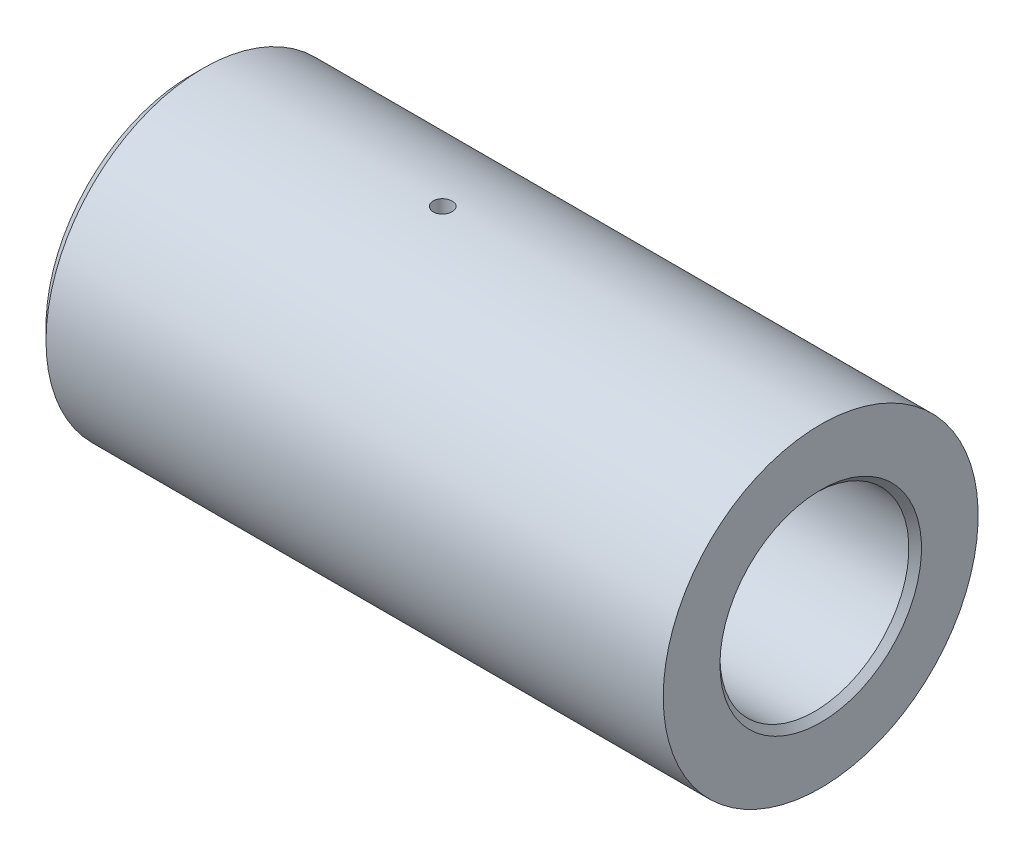
ISO-10303-21;
HEADER;
FILE_DESCRIPTION(('STEP AP214'),'2;1');
FILE_NAME('part.step','',(''),(''),'','','');
FILE_SCHEMA(('AUTOMOTIVE_DESIGN { 1 0 10303 214 1 1 1 1 }'));
ENDSEC;
DATA;
#1=APPLICATION_CONTEXT('core data for automotive mechanical design processes');
#2=APPLICATION_PROTOCOL_DEFINITION('international standard','automotive_design',2000,#1);
#3=PRODUCT_CONTEXT('',#1,'mechanical');
#4=PRODUCT('Part','Part','',(#3));
#5=PRODUCT_RELATED_PRODUCT_CATEGORY('part','',(#4));
#6=PRODUCT_DEFINITION_FORMATION('','',#4);
#7=PRODUCT_DEFINITION_CONTEXT('part definition',#1,'design');
#8=PRODUCT_DEFINITION('design','',#6,#7);
#9=PRODUCT_DEFINITION_SHAPE('','',#8);
#10=(LENGTH_UNIT() NAMED_UNIT(*) SI_UNIT(.MILLI.,.METRE.));
#11=(NAMED_UNIT(*) PLANE_ANGLE_UNIT() SI_UNIT($,.RADIAN.));
#12=(NAMED_UNIT(*) SI_UNIT($,.STERADIAN.) SOLID_ANGLE_UNIT());
#13=UNCERTAINTY_MEASURE_WITH_UNIT(LENGTH_MEASURE(1.E-05),#10,'distance_accuracy_value','');
#14=(GEOMETRIC_REPRESENTATION_CONTEXT(3) GLOBAL_UNCERTAINTY_ASSIGNED_CONTEXT((#13)) GLOBAL_UNIT_ASSIGNED_CONTEXT((#10,
#11,#12)) REPRESENTATION_CONTEXT('',''));
#15=CARTESIAN_POINT('',(0.,0.,0.));
#16=DIRECTION('',(0.,0.,1.));
#17=DIRECTION('',(1.,0.,0.));
#18=AXIS2_PLACEMENT_3D('',#15,#16,#17);
#19=CARTESIAN_POINT('',(0.,0.,0.));
#20=DIRECTION('',(-1.,0.,0.));
#21=DIRECTION('',(0.,0.,1.));
#22=AXIS2_PLACEMENT_3D('',#19,#20,#21);
#23=CYLINDRICAL_SURFACE('',#22,10.);
#24=CARTESIAN_POINT('',(0.999999999999977,0.,0.));
#25=DIRECTION('',(1.,0.,0.));
#26=DIRECTION('',(0.,0.,-1.));
#27=AXIS2_PLACEMENT_3D('',#24,#25,#26);
#28=CIRCLE('',#27,10.);
#29=CARTESIAN_POINT('',(0.999999999999977,0.,-10.));
#30=VERTEX_POINT('',#29);
#31=EDGE_CURVE('E58',#30,#30,#28,.F.);
#32=ORIENTED_EDGE('',*,*,#31,.T.);
#33=EDGE_LOOP('',(#32));
#34=FACE_BOUND('',#33,.T.);
#35=CARTESIAN_POINT('',(25.,0.,0.));
#36=DIRECTION('',(-1.,0.,0.));
#37=DIRECTION('',(0.,0.,1.));
#38=AXIS2_PLACEMENT_3D('',#35,#36,#37);
#39=CIRCLE('',#38,10.);
#40=CARTESIAN_POINT('',(25.,0.,10.));
#41=VERTEX_POINT('',#40);
#42=EDGE_CURVE('E188',#41,#41,#39,.T.);
#43=ORIENTED_EDGE('',*,*,#42,.F.);
#44=EDGE_LOOP('',(#43));
#45=FACE_BOUND('',#44,.T.);
#46=ADVANCED_FACE('F37',(#34,#45),#23,.F.);
#47=CARTESIAN_POINT('',(0.,10.,0.));
#48=DIRECTION('',(1.,0.,0.));
#49=DIRECTION('',(0.,0.,-1.));
#50=AXIS2_PLACEMENT_3D('',#47,#48,#49);
#51=PLANE('',#50);
#52=CARTESIAN_POINT('',(0.,0.,0.));
#53=DIRECTION('',(1.,0.,0.));
#54=DIRECTION('',(0.,0.,-1.));
#55=AXIS2_PLACEMENT_3D('',#52,#53,#54);
#56=CIRCLE('',#55,11.);
#57=CARTESIAN_POINT('',(0.,0.,-11.));
#58=VERTEX_POINT('',#57);
#59=EDGE_CURVE('E54',#58,#58,#56,.T.);
#60=ORIENTED_EDGE('',*,*,#59,.T.);
#61=EDGE_LOOP('',(#60));
#62=FACE_BOUND('',#61,.T.);
#63=CARTESIAN_POINT('',(0.,0.,0.));
#64=DIRECTION('',(1.,0.,0.));
#65=DIRECTION('',(0.,0.,-1.));
#66=AXIS2_PLACEMENT_3D('',#63,#64,#65);
#67=CIRCLE('',#66,23.);
#68=CARTESIAN_POINT('',(0.,0.,-23.));
#69=VERTEX_POINT('',#68);
#70=EDGE_CURVE('E161',#69,#69,#67,.F.);
#71=ORIENTED_EDGE('',*,*,#70,.T.);
#72=EDGE_LOOP('',(#71));
#73=FACE_BOUND('',#72,.T.);
#74=ADVANCED_FACE('F118',(#62,#73),#51,.F.);
#75=CARTESIAN_POINT('',(0.,0.,0.));
#76=DIRECTION('',(-1.,0.,0.));
#77=DIRECTION('',(0.,0.,1.));
#78=AXIS2_PLACEMENT_3D('',#75,#76,#77);
#79=CYLINDRICAL_SURFACE('',#78,25.);
#80=CARTESIAN_POINT('',(38.5,-25.,0.));
#81=CARTESIAN_POINT('',(38.500003706182,-24.9999994009396,0.0841744112906983));
#82=CARTESIAN_POINT('',(38.5071091377062,-24.9995703322505,0.168407925575419));
#83=CARTESIAN_POINT('',(38.5353523915698,-24.9978999420123,0.334549549235281));
#84=CARTESIAN_POINT('',(38.5565065901217,-24.9966576725644,0.416454828330709));
#85=CARTESIAN_POINT('',(38.6122380148838,-24.9935014300757,0.5755093310273));
#86=CARTESIAN_POINT('',(38.6468082125669,-24.9915878088006,0.652661020509562));
#87=CARTESIAN_POINT('',(38.7283790480555,-24.9873041548427,0.800046136146097));
#88=CARTESIAN_POINT('',(38.7753768200272,-24.9849342274195,0.870281152186768));
#89=CARTESIAN_POINT('',(38.8805405728725,-24.9800007098428,1.00195727834145));
#90=CARTESIAN_POINT('',(38.9387201682725,-24.9774368859408,1.0633875072824));
#91=CARTESIAN_POINT('',(39.064568149316,-24.9724065327507,1.17561728443768));
#92=CARTESIAN_POINT('',(39.132236929305,-24.9699400075116,1.22641639063194));
#93=CARTESIAN_POINT('',(39.2752032782622,-24.9653806252969,1.31597486784903));
#94=CARTESIAN_POINT('',(39.3505064633041,-24.9632880465787,1.35472528905778));
#95=CARTESIAN_POINT('',(39.5065646395759,-24.9597155336563,1.41902912258916));
#96=CARTESIAN_POINT('',(39.5873195759334,-24.9582355932868,1.44458266771711));
#97=CARTESIAN_POINT('',(39.7518848579348,-24.9560574575134,1.48173741565118));
#98=CARTESIAN_POINT('',(39.8356913703657,-24.9553583140724,1.49335553999937));
#99=CARTESIAN_POINT('',(40.0040677798979,-24.954817773996,1.50236188160072));
#100=CARTESIAN_POINT('',(40.0886376689152,-24.954976368288,1.49975024936641));
#101=CARTESIAN_POINT('',(40.2560249625796,-24.9561325386846,1.48038526467145));
#102=CARTESIAN_POINT('',(40.3388444934696,-24.9571290288072,1.46365021721638));
#103=CARTESIAN_POINT('',(40.5004967591683,-24.9598469788447,1.41654183568935));
#104=CARTESIAN_POINT('',(40.5793294716157,-24.9615684428253,1.38616842513185));
#105=CARTESIAN_POINT('',(40.7308291732036,-24.9655435872457,1.31262469930024));
#106=CARTESIAN_POINT('',(40.8034921175736,-24.9677976132153,1.26944607125188));
#107=CARTESIAN_POINT('',(40.94054542463,-24.9725835122349,1.17152362364147));
#108=CARTESIAN_POINT('',(41.004935701836,-24.9751153881552,1.11677968459202));
#109=CARTESIAN_POINT('',(41.1237223810788,-24.9801764756538,0.997177453913965));
#110=CARTESIAN_POINT('',(41.1781028321263,-24.9827056767018,0.932303318346458));
#111=CARTESIAN_POINT('',(41.275203187104,-24.9874725341813,0.794337807078347));
#112=CARTESIAN_POINT('',(41.3179230872505,-24.9897101905182,0.721246428711381));
#113=CARTESIAN_POINT('',(41.3904882900073,-24.9936419598513,0.568911628096267));
#114=CARTESIAN_POINT('',(41.4203329988203,-24.9953360477775,0.489667922304728));
#115=CARTESIAN_POINT('',(41.4662900315718,-24.9979894319355,0.327282186584158));
#116=CARTESIAN_POINT('',(41.4824025033425,-24.9989487360774,0.244140198631621));
#117=CARTESIAN_POINT('',(41.5004179459624,-25.0000234317371,0.0764564081212715));
#118=CARTESIAN_POINT('',(41.5023429725754,-25.000140133157,-0.00808301680837487));
#119=CARTESIAN_POINT('',(41.4919864934571,-24.9995199551995,-0.176283598525665));
#120=CARTESIAN_POINT('',(41.4797050557785,-24.998783079911,-0.25994475951849));
#121=CARTESIAN_POINT('',(41.4413025336056,-24.9965395546253,-0.423951918612617));
#122=CARTESIAN_POINT('',(41.4151915577337,-24.9950334669082,-0.504300292000608));
#123=CARTESIAN_POINT('',(41.3498814166804,-24.991420983828,-0.659474362375056));
#124=CARTESIAN_POINT('',(41.3106821429513,-24.9893145834861,-0.73430001355259));
#125=CARTESIAN_POINT('',(41.2202519136995,-24.9847349543981,-0.876405673907379));
#126=CARTESIAN_POINT('',(41.1690062158468,-24.982261277559,-0.943676287014668));
#127=CARTESIAN_POINT('',(41.0559592915908,-24.9772270256052,-1.06866774190152));
#128=CARTESIAN_POINT('',(40.9941579691759,-24.9746664497003,-1.12638849680831));
#129=CARTESIAN_POINT('',(40.8616590117008,-24.9697432142549,-1.23071636822772));
#130=CARTESIAN_POINT('',(40.7909501058566,-24.9673808118859,-1.27730918435508));
#131=CARTESIAN_POINT('',(40.6426998598921,-24.9631244152043,-1.35796077823128));
#132=CARTESIAN_POINT('',(40.5651585592251,-24.9612304181871,-1.39201962835089));
#133=CARTESIAN_POINT('',(40.4054970323861,-24.9581262710517,-1.44661168369627));
#134=CARTESIAN_POINT('',(40.3233799015864,-24.9569156646707,-1.46715391475466));
#135=CARTESIAN_POINT('',(40.1568546515416,-24.9553135506001,-1.49415910044393));
#136=CARTESIAN_POINT('',(40.0724465529164,-24.9549220355407,-1.50062218175197));
#137=CARTESIAN_POINT('',(39.9038776251556,-24.9550024337275,-1.49928439559963));
#138=CARTESIAN_POINT('',(39.8197166160021,-24.955472985906,-1.49150601316709));
#139=CARTESIAN_POINT('',(39.6538978753677,-24.9572216088909,-1.46195268745905));
#140=CARTESIAN_POINT('',(39.5722401484791,-24.9584996811785,-1.44017771850782));
#141=CARTESIAN_POINT('',(39.413742287979,-24.9617189844004,-1.38325430313315));
#142=CARTESIAN_POINT('',(39.3369021374244,-24.9636602130022,-1.34810590374646));
#143=CARTESIAN_POINT('',(39.1902110162464,-24.9679870227359,-1.26543658450865));
#144=CARTESIAN_POINT('',(39.1203598574009,-24.9703725918963,-1.2179159979801));
#145=CARTESIAN_POINT('',(38.9895157860027,-24.9753236195898,-1.11176851558593));
#146=CARTESIAN_POINT('',(38.9285359962889,-24.9778893364568,-1.05312545630152));
#147=CARTESIAN_POINT('',(38.8172659186456,-24.9829093861692,-0.926417671082014));
#148=CARTESIAN_POINT('',(38.7669782528211,-24.9853636915766,-0.858350640782171));
#149=CARTESIAN_POINT('',(38.678485842974,-24.9898867196811,-0.714654868135344));
#150=CARTESIAN_POINT('',(38.6402953770515,-24.9919549855695,-0.639017327934042));
#151=CARTESIAN_POINT('',(38.5772024182904,-24.9954666177913,-0.482446674586143));
#152=CARTESIAN_POINT('',(38.5522843340497,-24.9969107169712,-0.401519900921799));
#153=CARTESIAN_POINT('',(38.5229328707374,-24.9986320978355,-0.266746945425286));
#154=CARTESIAN_POINT('',(38.5143441337415,-24.9991427869583,-0.213772324734724));
#155=CARTESIAN_POINT('',(38.5028765216484,-24.9998269286143,-0.107206461740472));
#156=CARTESIAN_POINT('',(38.4999976393329,-25.0000003815739,-0.0536152202163858));
#157=CARTESIAN_POINT('',(38.5,-25.,0.));
#158=B_SPLINE_CURVE_WITH_KNOTS('',3,(#80,#81,#82,#83,#84,#85,#86,#87,#88,#89,#90,#91,#92,#93,
#94,#95,#96,#97,#98,#99,#100,#101,#102,#103,#104,#105,#106,#107,#108,#109,#110,#111,#112,#113,
#114,#115,#116,#117,#118,#119,#120,#121,#122,#123,#124,#125,#126,#127,#128,#129,#130,#131,#132,
#133,#134,#135,#136,#137,#138,#139,#140,#141,#142,#143,#144,#145,#146,#147,#148,#149,#150,#151,
#152,#153,#154,#155,#156,#157),.UNSPECIFIED.,.T.,.F.,(4,2,2,2,2,2,2,2,2,2,2,2,2,2,2,2,2,2,2,2,2,
2,2,2,2,2,2,2,2,2,2,2,2,2,2,2,2,2,4),(0.,0.252327509077057,0.504949665992943,0.757439654594841,
1.00987146898755,1.26261260362566,1.51536424463009,1.76830318456219,2.02123957902124,
2.27386852521718,2.52649479928367,2.77879415269301,3.03109492104442,3.2835598355736,
3.53602735857987,3.78889377835759,4.04176028018659,4.29463844284422,4.54751388314835,
4.79999612089069,5.05247714918091,5.30477388207094,5.55707270743324,5.80968191670635,
6.06229342377877,6.31522783298443,6.56816078173089,6.82092466056897,7.07368626515452,
7.3260491430634,7.57841248391492,7.83077493716769,8.08313059215596,8.33585582543012,
8.58864296499107,8.84172736228347,9.09451379555064,9.25523499170701,9.41595598468309),.UNSPECIFIED.);
#159=CARTESIAN_POINT('',(38.5,-25.,0.));
#160=VERTEX_POINT('',#159);
#161=EDGE_CURVE('E10',#160,#160,#158,.T.);
#162=ORIENTED_EDGE('',*,*,#161,.T.);
#163=EDGE_LOOP('',(#162));
#164=FACE_BOUND('',#163,.T.);
#165=CARTESIAN_POINT('',(40.,24.9549594269356,1.49999999999999));
#166=CARTESIAN_POINT('',(39.915825742496,24.9549600300317,1.49999629367853));
#167=CARTESIAN_POINT('',(39.8315923814798,24.9553898919632,1.49289088723916));
#168=CARTESIAN_POINT('',(39.6654510762883,24.9570631163396,1.46464774207901));
#169=CARTESIAN_POINT('',(39.5835459625127,24.9583074281733,1.44349362662338));
#170=CARTESIAN_POINT('',(39.4244918092883,24.9614681027882,1.38776244497561));
#171=CARTESIAN_POINT('',(39.347340302558,24.9633841134208,1.35319241127322));
#172=CARTESIAN_POINT('',(39.1999554927473,24.9676718488877,1.2716219618701));
#173=CARTESIAN_POINT('',(39.1297206000115,24.9700434686372,1.22462441159698));
#174=CARTESIAN_POINT('',(38.9980443330509,24.9749789472156,1.1194608820427));
#175=CARTESIAN_POINT('',(38.93661387943,24.9775430388755,1.06128123877002));
#176=CARTESIAN_POINT('',(38.8243836690896,24.9825723731579,0.935433067856952));
#177=CARTESIAN_POINT('',(38.7735843537017,24.9850376116732,0.867764146481716));
#178=CARTESIAN_POINT('',(38.6840256589564,24.9895934208353,0.724797675208393));
#179=CARTESIAN_POINT('',(38.6452751906506,24.9916837136997,0.649494533535976));
#180=CARTESIAN_POINT('',(38.5809712580593,24.9952516671057,0.493436451566957));
#181=CARTESIAN_POINT('',(38.5554176615375,24.9967293337859,0.412681565907558));
#182=CARTESIAN_POINT('',(38.5182628043925,24.9989039357683,0.248116432778315));
#183=CARTESIAN_POINT('',(38.5066446183536,24.999601818096,0.164310019372329));
#184=CARTESIAN_POINT('',(38.4976381190678,25.0001414004183,-0.00406619674097467));
#185=CARTESIAN_POINT('',(38.5002496559621,24.9999831094297,-0.0886359913994625));
#186=CARTESIAN_POINT('',(38.5196144910425,24.9988289734266,-0.256023709101287));
#187=CARTESIAN_POINT('',(38.536349580158,24.9978342068609,-0.338843747190685));
#188=CARTESIAN_POINT('',(38.583458221337,24.9951203677711,-0.50049700582433));
#189=CARTESIAN_POINT('',(38.6138318489557,24.9934012912345,-0.57933020427949));
#190=CARTESIAN_POINT('',(38.6873760214698,24.9894305509762,-0.730830489828705));
#191=CARTESIAN_POINT('',(38.7305548280396,24.987178543607,-0.803493557011326));
#192=CARTESIAN_POINT('',(38.8284776551981,24.9823954231729,-0.940547033718832));
#193=CARTESIAN_POINT('',(38.8832217953822,24.9798643072219,-1.00493735768536));
#194=CARTESIAN_POINT('',(39.0028241670928,24.9748031593022,-1.12372380476942));
#195=CARTESIAN_POINT('',(39.0676982019148,24.972273135328,-1.17810401764929));
#196=CARTESIAN_POINT('',(39.2056634273535,24.9675033967139,-1.27520394033666));
#197=CARTESIAN_POINT('',(39.2787546209749,24.96526368218,-1.31792364588029));
#198=CARTESIAN_POINT('',(39.4310893750399,24.9613274543607,-1.39048870924374));
#199=CARTESIAN_POINT('',(39.5103332480124,24.9596309686913,-1.42033341256491));
#200=CARTESIAN_POINT('',(39.6727193465946,24.9569735139226,-1.46629038294868));
#201=CARTESIAN_POINT('',(39.7558615299454,24.9560125368521,-1.48240279883675));
#202=CARTESIAN_POINT('',(39.9235454057691,24.9549359603509,-1.50041803122796));
#203=CARTESIAN_POINT('',(40.0080847148941,24.9548190455977,-1.50234295653499));
#204=CARTESIAN_POINT('',(40.1762850405415,24.9554403428122,-1.4919863161538));
#205=CARTESIAN_POINT('',(40.2599460612687,24.9561785506842,-1.47970481851038));
#206=CARTESIAN_POINT('',(40.4239525508928,24.9584256981138,-1.44130231806504));
#207=CARTESIAN_POINT('',(40.5043004092051,24.9599340713456,-1.41519148386754));
#208=CARTESIAN_POINT('',(40.6594735122597,24.9635510809282,-1.34988179901678));
#209=CARTESIAN_POINT('',(40.734298710843,24.9656597222954,-1.31068283898678));
#210=CARTESIAN_POINT('',(40.8764040714476,24.9702428271324,-1.22025306655629));
#211=CARTESIAN_POINT('',(40.9436747865983,24.9727177398586,-1.16900743202448));
#212=CARTESIAN_POINT('',(41.0686664769422,24.9777529022322,-1.05596057652177));
#213=CARTESIAN_POINT('',(41.1263873656994,24.9803131526518,-0.994159260021291));
#214=CARTESIAN_POINT('',(41.2307155140826,24.9852343171827,-0.861660242357582));
#215=CARTESIAN_POINT('',(41.2773084725469,24.9875949722934,-0.790951269706825));
#216=CARTESIAN_POINT('',(41.3579603164173,24.9918472173968,-0.642700853338524));
#217=CARTESIAN_POINT('',(41.3920192742066,24.9937388100983,-0.56515944908116));
#218=CARTESIAN_POINT('',(41.4466114035117,24.9968385433506,-0.405497997606175));
#219=CARTESIAN_POINT('',(41.4671536474445,24.9980471422498,-0.323381061721332));
#220=CARTESIAN_POINT('',(41.4941589249725,24.9996465260776,-0.156856221762157));
#221=CARTESIAN_POINT('',(41.5006220842115,25.0000373183046,-0.072448338139416));
#222=CARTESIAN_POINT('',(41.4992845201593,24.9999570780358,0.0961207332461746));
#223=CARTESIAN_POINT('',(41.4915061889346,24.9994873984695,0.180282100246806));
#224=CARTESIAN_POINT('',(41.4619528395094,24.9977417270832,0.346101569050349));
#225=CARTESIAN_POINT('',(41.4401777962734,24.9964657338211,0.427759666375486));
#226=CARTESIAN_POINT('',(41.3832540983733,24.9932508853364,0.586258250769405));
#227=CARTESIAN_POINT('',(41.3481054900667,24.9913120324117,0.663098754536593));
#228=CARTESIAN_POINT('',(41.2654356440707,24.9869892318681,0.809790494584371));
#229=CARTESIAN_POINT('',(41.2179147400875,24.9846052962545,0.879641919304413));
#230=CARTESIAN_POINT('',(41.1117669143717,24.9796560975471,1.01048596126015));
#231=CARTESIAN_POINT('',(41.0531239014044,24.9770905751506,1.07146551413196));
#232=CARTESIAN_POINT('',(40.9264163054458,24.9720693720982,1.1827351356214));
#233=CARTESIAN_POINT('',(40.8583494175739,24.969613718509,1.23302258152253));
#234=CARTESIAN_POINT('',(40.7146537550239,24.9650870313927,1.32151476133075));
#235=CARTESIAN_POINT('',(40.6390161570939,24.9630164548729,1.35970517585709));
#236=CARTESIAN_POINT('',(40.4824453801455,24.9595002684231,1.42279802241095));
#237=CARTESIAN_POINT('',(40.4015185409405,24.9580539255344,1.44771604662733));
#238=CARTESIAN_POINT('',(40.266745746732,24.9563297281718,1.477067336489));
#239=CARTESIAN_POINT('',(40.2137713651314,24.9558181549229,1.48565599553077));
#240=CARTESIAN_POINT('',(40.1072059814227,24.9551328124479,1.49712350402983));
#241=CARTESIAN_POINT('',(40.0536149800991,24.9549590427922,1.50000236074967));
#242=CARTESIAN_POINT('',(40.,24.9549594269356,1.49999999999999));
#243=B_SPLINE_CURVE_WITH_KNOTS('',3,(#165,#166,#167,#168,#169,#170,#171,#172,#173,#174,#175,
#176,#177,#178,#179,#180,#181,#182,#183,#184,#185,#186,#187,#188,#189,#190,#191,#192,#193,#194,
#195,#196,#197,#198,#199,#200,#201,#202,#203,#204,#205,#206,#207,#208,#209,#210,#211,#212,#213,
#214,#215,#216,#217,#218,#219,#220,#221,#222,#223,#224,#225,#226,#227,#228,#229,#230,#231,#232,
#233,#234,#235,#236,#237,#238,#239,#240,#241,#242),.UNSPECIFIED.,.T.,.F.,(4,2,2,2,2,2,2,2,2,2,2,
2,2,2,2,2,2,2,2,2,2,2,2,2,2,2,2,2,2,2,2,2,2,2,2,2,2,2,4),(0.,0.252327047205413,
0.504948752345383,0.757438214199368,1.00986950993718,1.2626112488118,1.51536347770389,
1.76830219416344,2.02123837605551,2.27386703926159,2.52649304194185,2.77879383820878,
3.03109603219529,3.28356136253977,3.53602930372081,3.78889512066042,4.04176103006471,
4.29463979235215,4.54751581399801,4.7999976876621,5.05247835201358,5.30477362648824,
5.55707100943358,5.80968045699246,6.06229219080373,6.31522684471346,6.56816003791438,
6.82092328873067,7.07368428383796,7.32604820102925,7.57841256961529,7.83077606342528,
8.08313275117972,8.33585736760374,8.58864390468434,8.84172855917082,9.09451523445978,
9.25523571151601,9.41595598414488),.UNSPECIFIED.);
#244=CARTESIAN_POINT('',(40.,24.9549594269356,1.49999999999999));
#245=VERTEX_POINT('',#244);
#246=EDGE_CURVE('E50',#245,#245,#243,.T.);
#247=ORIENTED_EDGE('',*,*,#246,.T.);
#248=EDGE_LOOP('',(#247));
#249=FACE_BOUND('',#248,.T.);
#250=CARTESIAN_POINT('',(2.00000000000003,0.,0.));
#251=DIRECTION('',(1.,0.,0.));
#252=DIRECTION('',(0.,0.,-1.));
#253=AXIS2_PLACEMENT_3D('',#250,#251,#252);
#254=CIRCLE('',#253,25.);
#255=CARTESIAN_POINT('',(2.00000000000003,0.,-25.));
#256=VERTEX_POINT('',#255);
#257=EDGE_CURVE('E157',#256,#256,#254,.T.);
#258=ORIENTED_EDGE('',*,*,#257,.T.);
#259=EDGE_LOOP('',(#258));
#260=FACE_BOUND('',#259,.T.);
#261=CARTESIAN_POINT('',(100.,0.,0.));
#262=DIRECTION('',(-1.,0.,0.));
#263=DIRECTION('',(0.,0.,1.));
#264=AXIS2_PLACEMENT_3D('',#261,#262,#263);
#265=CIRCLE('',#264,25.);
#266=CARTESIAN_POINT('',(100.,0.,25.));
#267=VERTEX_POINT('',#266);
#268=EDGE_CURVE('E174',#267,#267,#265,.T.);
#269=ORIENTED_EDGE('',*,*,#268,.T.);
#270=EDGE_LOOP('',(#269));
#271=FACE_BOUND('',#270,.T.);
#272=ADVANCED_FACE('F64',(#164,#249,#260,#271),#79,.T.);
#273=CARTESIAN_POINT('',(100.,25.,0.));
#274=DIRECTION('',(-1.,0.,0.));
#275=DIRECTION('',(0.,0.,1.));
#276=AXIS2_PLACEMENT_3D('',#273,#274,#275);
#277=PLANE('',#276);
#278=CARTESIAN_POINT('',(100.,0.,0.));
#279=DIRECTION('',(-1.,0.,0.));
#280=DIRECTION('',(0.,0.,1.));
#281=AXIS2_PLACEMENT_3D('',#278,#279,#280);
#282=CIRCLE('',#281,16.);
#283=CARTESIAN_POINT('',(100.,0.,16.));
#284=VERTEX_POINT('',#283);
#285=EDGE_CURVE('E156',#284,#284,#282,.T.);
#286=ORIENTED_EDGE('',*,*,#285,.T.);
#287=EDGE_LOOP('',(#286));
#288=FACE_BOUND('',#287,.T.);
#289=ORIENTED_EDGE('',*,*,#268,.F.);
#290=EDGE_LOOP('',(#289));
#291=FACE_BOUND('',#290,.T.);
#292=ADVANCED_FACE('F111',(#288,#291),#277,.F.);
#293=CARTESIAN_POINT('',(0.,0.,0.));
#294=DIRECTION('',(-1.,0.,0.));
#295=DIRECTION('',(0.,0.,1.));
#296=AXIS2_PLACEMENT_3D('',#293,#294,#295);
#297=CYLINDRICAL_SURFACE('',#296,15.);
#298=CARTESIAN_POINT('',(99.,0.,0.));
#299=DIRECTION('',(-1.,0.,0.));
#300=DIRECTION('',(0.,0.,1.));
#301=AXIS2_PLACEMENT_3D('',#298,#299,#300);
#302=CIRCLE('',#301,15.);
#303=CARTESIAN_POINT('',(99.,0.,15.));
#304=VERTEX_POINT('',#303);
#305=EDGE_CURVE('E154',#304,#304,#302,.F.);
#306=ORIENTED_EDGE('',*,*,#305,.T.);
#307=EDGE_LOOP('',(#306));
#308=FACE_BOUND('',#307,.T.);
#309=CARTESIAN_POINT('',(65.,0.,0.));
#310=DIRECTION('',(-1.,0.,0.));
#311=DIRECTION('',(0.,0.,1.));
#312=AXIS2_PLACEMENT_3D('',#309,#310,#311);
#313=CIRCLE('',#312,15.);
#314=CARTESIAN_POINT('',(65.,0.,15.));
#315=VERTEX_POINT('',#314);
#316=EDGE_CURVE('E177',#315,#315,#313,.T.);
#317=ORIENTED_EDGE('',*,*,#316,.T.);
#318=EDGE_LOOP('',(#317));
#319=FACE_BOUND('',#318,.T.);
#320=ADVANCED_FACE('F108',(#308,#319),#297,.F.);
#321=CARTESIAN_POINT('',(65.,15.,0.));
#322=DIRECTION('',(1.,0.,0.));
#323=DIRECTION('',(0.,0.,-1.));
#324=AXIS2_PLACEMENT_3D('',#321,#322,#323);
#325=PLANE('',#324);
#326=ORIENTED_EDGE('',*,*,#316,.F.);
#327=EDGE_LOOP('',(#326));
#328=FACE_BOUND('',#327,.T.);
#329=CARTESIAN_POINT('',(65.,0.,0.));
#330=DIRECTION('',(-1.,0.,0.));
#331=DIRECTION('',(0.,0.,1.));
#332=AXIS2_PLACEMENT_3D('',#329,#330,#331);
#333=CIRCLE('',#332,18.);
#334=CARTESIAN_POINT('',(65.,0.,18.));
#335=VERTEX_POINT('',#334);
#336=EDGE_CURVE('E180',#335,#335,#333,.T.);
#337=ORIENTED_EDGE('',*,*,#336,.T.);
#338=EDGE_LOOP('',(#337));
#339=FACE_BOUND('',#338,.T.);
#340=ADVANCED_FACE('F104',(#328,#339),#325,.F.);
#341=CARTESIAN_POINT('',(0.,0.,0.));
#342=DIRECTION('',(-1.,0.,0.));
#343=DIRECTION('',(0.,0.,1.));
#344=AXIS2_PLACEMENT_3D('',#341,#342,#343);
#345=CYLINDRICAL_SURFACE('',#344,18.);
#346=ORIENTED_EDGE('',*,*,#336,.F.);
#347=EDGE_LOOP('',(#346));
#348=FACE_BOUND('',#347,.T.);
#349=CARTESIAN_POINT('',(60.,0.,0.));
#350=DIRECTION('',(-1.,0.,0.));
#351=DIRECTION('',(0.,0.,1.));
#352=AXIS2_PLACEMENT_3D('',#349,#350,#351);
#353=CIRCLE('',#352,18.);
#354=CARTESIAN_POINT('',(60.,0.,18.));
#355=VERTEX_POINT('',#354);
#356=EDGE_CURVE('E183',#355,#355,#353,.T.);
#357=ORIENTED_EDGE('',*,*,#356,.T.);
#358=EDGE_LOOP('',(#357));
#359=FACE_BOUND('',#358,.T.);
#360=ADVANCED_FACE('F100',(#348,#359),#345,.F.);
#361=CARTESIAN_POINT('',(60.,18.,0.));
#362=DIRECTION('',(-1.,0.,0.));
#363=DIRECTION('',(0.,0.,1.));
#364=AXIS2_PLACEMENT_3D('',#361,#362,#363);
#365=PLANE('',#364);
#366=ORIENTED_EDGE('',*,*,#356,.F.);
#367=EDGE_LOOP('',(#366));
#368=FACE_BOUND('',#367,.T.);
#369=CARTESIAN_POINT('',(60.,0.,0.));
#370=DIRECTION('',(-1.,0.,0.));
#371=DIRECTION('',(0.,0.,1.));
#372=AXIS2_PLACEMENT_3D('',#369,#370,#371);
#373=CIRCLE('',#372,15.);
#374=CARTESIAN_POINT('',(60.,0.,15.));
#375=VERTEX_POINT('',#374);
#376=EDGE_CURVE('E186',#375,#375,#373,.T.);
#377=ORIENTED_EDGE('',*,*,#376,.T.);
#378=EDGE_LOOP('',(#377));
#379=FACE_BOUND('',#378,.T.);
#380=ADVANCED_FACE('F95',(#368,#379),#365,.F.);
#381=CARTESIAN_POINT('',(0.,0.,0.));
#382=DIRECTION('',(-1.,0.,0.));
#383=DIRECTION('',(0.,0.,1.));
#384=AXIS2_PLACEMENT_3D('',#381,#382,#383);
#385=CYLINDRICAL_SURFACE('',#384,15.);
#386=CARTESIAN_POINT('',(40.,-14.9248115565993,1.49999999999999));
#387=CARTESIAN_POINT('',(39.9159706537396,-14.9248125419535,1.49999636009026));
#388=CARTESIAN_POINT('',(39.8318857473822,-14.9255288549133,1.4929152884737));
#389=CARTESIAN_POINT('',(39.6660472205597,-14.9283163133718,1.46477447214533));
#390=CARTESIAN_POINT('',(39.5842962729438,-14.9303889519183,1.44369932232964));
#391=CARTESIAN_POINT('',(39.4255512711731,-14.9356519957108,1.38819017410338));
#392=CARTESIAN_POINT('',(39.3485543659128,-14.9388417232018,1.35376427444084));
#393=CARTESIAN_POINT('',(39.2014483115624,-14.9459787085773,1.27254640108664));
#394=CARTESIAN_POINT('',(39.1313377982744,-14.9499258159649,1.22575688343888));
#395=CARTESIAN_POINT('',(38.9997231045138,-14.9581489006485,1.12095714299805));
#396=CARTESIAN_POINT('',(38.9382474857443,-14.962425900079,1.06291112716238));
#397=CARTESIAN_POINT('',(38.8258935864947,-14.9708175785358,0.937322572979337));
#398=CARTESIAN_POINT('',(38.7750157908905,-14.9749322501282,0.869779600359844));
#399=CARTESIAN_POINT('',(38.6852031144893,-14.9825457473341,0.726939542476473));
#400=CARTESIAN_POINT('',(38.6462935018095,-14.9860432634197,0.651626493794344));
#401=CARTESIAN_POINT('',(38.581683350277,-14.9920172531366,0.495494976431256));
#402=CARTESIAN_POINT('',(38.5559824894458,-14.9944937516559,0.414676642002319));
#403=CARTESIAN_POINT('',(38.5186031359701,-14.9981394985654,0.250117174114417));
#404=CARTESIAN_POINT('',(38.5068777508751,-14.9993131176422,0.166386790547366));
#405=CARTESIAN_POINT('',(38.4976370962994,-15.0002357339804,-0.00186111103341932));
#406=CARTESIAN_POINT('',(38.5001214583806,-14.9999847681791,-0.0863786085816959));
#407=CARTESIAN_POINT('',(38.5191917089752,-14.9980900696678,-0.253483266096842));
#408=CARTESIAN_POINT('',(38.5357271733458,-14.9964513172757,-0.336076244902469));
#409=CARTESIAN_POINT('',(38.5823516934199,-14.9919709389739,-0.497308769256799));
#410=CARTESIAN_POINT('',(38.6124409251814,-14.9891292974393,-0.575948263436593));
#411=CARTESIAN_POINT('',(38.6853741448817,-14.9825540622587,-0.727200472019379));
#412=CARTESIAN_POINT('',(38.7282404462952,-14.9788189104864,-0.799802356472473));
#413=CARTESIAN_POINT('',(38.8254947850046,-14.9708757677911,-0.936800269761289));
#414=CARTESIAN_POINT('',(38.8798831602178,-14.9666677630022,-1.00119605784124));
#415=CARTESIAN_POINT('',(38.9989213442705,-14.9582294020178,-1.12024915773403));
#416=CARTESIAN_POINT('',(39.0636150171124,-14.9539990285954,-1.17486261928551));
#417=CARTESIAN_POINT('',(39.2012752978162,-14.9460110989233,-1.27246130303687));
#418=CARTESIAN_POINT('',(39.2742419176782,-14.9422535433595,-1.31544650836933));
#419=CARTESIAN_POINT('',(39.4264105377997,-14.9356363427122,-1.38856827685984));
#420=CARTESIAN_POINT('',(39.5056138486343,-14.9327768869883,-1.41870213085943));
#421=CARTESIAN_POINT('',(39.667990906922,-14.9282835280641,-1.46523110345637));
#422=CARTESIAN_POINT('',(39.7511645333312,-14.9266495875265,-1.48162664061454));
#423=CARTESIAN_POINT('',(39.9187362692943,-14.9247987079112,-1.50015716308793));
#424=CARTESIAN_POINT('',(40.0031275303973,-14.924575673214,-1.50235349497081));
#425=CARTESIAN_POINT('',(40.1710768987343,-14.9255557703216,-1.49258437030703));
#426=CARTESIAN_POINT('',(40.2546350172106,-14.9267588828559,-1.48061910511462));
#427=CARTESIAN_POINT('',(40.4183673734175,-14.930450166336,-1.44291776176127));
#428=CARTESIAN_POINT('',(40.498548356642,-14.9329356300202,-1.41721069078335));
#429=CARTESIAN_POINT('',(40.6534600775955,-14.9389093655819,-1.3527850795139));
#430=CARTESIAN_POINT('',(40.7281906904308,-14.94239766043,-1.31406624117537));
#431=CARTESIAN_POINT('',(40.8703599610432,-14.9499987653357,-1.22456250213482));
#432=CARTESIAN_POINT('',(40.9377729129494,-14.9541136622201,-1.17373694976103));
#433=CARTESIAN_POINT('',(41.0631325799111,-14.9624974893778,-1.06152080017675));
#434=CARTESIAN_POINT('',(41.1210790605101,-14.966766423463,-1.00012994137219));
#435=CARTESIAN_POINT('',(41.2260724500971,-14.9749957177395,-0.868259706339703));
#436=CARTESIAN_POINT('',(41.2730793393793,-14.9789549108321,-0.79774838395417));
#437=CARTESIAN_POINT('',(41.3545838027596,-14.9861016315994,-0.649796576125688));
#438=CARTESIAN_POINT('',(41.3890815482607,-14.9892891698474,-0.57235618564443));
#439=CARTESIAN_POINT('',(41.444520651483,-14.9945281562101,-0.412884189649215));
#440=CARTESIAN_POINT('',(41.4654861809878,-14.9965816290847,-0.330861056474933));
#441=CARTESIAN_POINT('',(41.4933446043698,-14.9993294192047,-0.164437220975514));
#442=CARTESIAN_POINT('',(41.500237893751,-15.0000237746484,-0.0800365855383227));
#443=CARTESIAN_POINT('',(41.4997506003401,-14.999975074699,0.0883533361136228));
#444=CARTESIAN_POINT('',(41.492432144745,-14.99923827565,0.172342810836795));
#445=CARTESIAN_POINT('',(41.4638593815145,-14.9964224036639,0.337892832534547));
#446=CARTESIAN_POINT('',(41.4426050629405,-14.9943433296731,0.419453377602551));
#447=CARTESIAN_POINT('',(41.3867811139106,-14.9890758572094,0.577829863151615));
#448=CARTESIAN_POINT('',(41.3522132995988,-14.9858876100487,0.654646449116291));
#449=CARTESIAN_POINT('',(41.2707502466245,-14.9787571862444,0.80139690023219));
#450=CARTESIAN_POINT('',(41.2238550800933,-14.9748150140123,0.871330805652835));
#451=CARTESIAN_POINT('',(41.1188355714644,-14.9665977700358,1.0026490866404));
#452=CARTESIAN_POINT('',(41.0606649756328,-14.9623213719105,1.06399638932901));
#453=CARTESIAN_POINT('',(40.9348369726818,-14.9539288615449,1.17608663908971));
#454=CARTESIAN_POINT('',(40.8671772922464,-14.9498127880166,1.22682703777177));
#455=CARTESIAN_POINT('',(40.7241034871201,-14.942195751159,1.31636496063607));
#456=CARTESIAN_POINT('',(40.6486700780139,-14.9386963788796,1.35513178199224));
#457=CARTESIAN_POINT('',(40.4923775631307,-14.9327279214369,1.41939706214814));
#458=CARTESIAN_POINT('',(40.4115246941114,-14.9302576748004,1.44491048683478));
#459=CARTESIAN_POINT('',(40.2751783886513,-14.9272501130722,1.47558253250028));
#460=CARTESIAN_POINT('',(40.2205566230404,-14.9263399790354,1.48472656859733));
#461=CARTESIAN_POINT('',(40.1106312654362,-14.9251203776649,1.49693648790766));
#462=CARTESIAN_POINT('',(40.0553276763061,-14.9248109078098,1.50000239663589));
#463=CARTESIAN_POINT('',(40.,-14.9248115565993,1.49999999999999));
#464=B_SPLINE_CURVE_WITH_KNOTS('',3,(#386,#387,#388,#389,#390,#391,#392,#393,#394,#395,#396,
#397,#398,#399,#400,#401,#402,#403,#404,#405,#406,#407,#408,#409,#410,#411,#412,#413,#414,#415,
#416,#417,#418,#419,#420,#421,#422,#423,#424,#425,#426,#427,#428,#429,#430,#431,#432,#433,#434,
#435,#436,#437,#438,#439,#440,#441,#442,#443,#444,#445,#446,#447,#448,#449,#450,#451,#452,#453,
#454,#455,#456,#457,#458,#459,#460,#461,#462,#463),.UNSPECIFIED.,.T.,.F.,(4,2,2,2,2,2,2,2,2,2,2,
2,2,2,2,2,2,2,2,2,2,2,2,2,2,2,2,2,2,2,2,2,2,2,2,2,2,2,4),(0.,0.251885991654698,
0.504049727732654,0.756060736496209,1.00802172063197,1.26079742294887,1.51358468782879,
1.76690204956937,2.02021323611691,2.27267206347673,2.52512434497347,2.77667447727991,
3.0282278772146,3.28022318199618,3.53222587827792,3.785331376275,4.03843724141342,
4.29159643676898,4.54474791892547,4.79680494461646,5.04885856450303,5.30038222056788,
5.55191163841568,5.80429784717573,6.056690305848,6.30999205227174,6.56329032777004,
6.81613489041538,7.0689723466972,7.3207070020272,7.57244185494983,7.82414237992864,
8.07584143216193,8.32859572556977,8.58141067551782,8.83486861605708,9.08803972340996,
9.25389041409063,9.41974040855717),.UNSPECIFIED.);
#465=CARTESIAN_POINT('',(40.,-14.9248115565993,1.49999999999999));
#466=VERTEX_POINT('',#465);
#467=EDGE_CURVE('E86',#466,#466,#464,.T.);
#468=ORIENTED_EDGE('',*,*,#467,.T.);
#469=EDGE_LOOP('',(#468));
#470=FACE_BOUND('',#469,.T.);
#471=CARTESIAN_POINT('',(40.,14.9248115565993,1.49999999999999));
#472=CARTESIAN_POINT('',(40.0840293462604,14.9248125419535,1.49999636009026));
#473=CARTESIAN_POINT('',(40.1681142526178,14.9255288549133,1.4929152884737));
#474=CARTESIAN_POINT('',(40.3339527794403,14.9283163133718,1.46477447214533));
#475=CARTESIAN_POINT('',(40.4157037270562,14.9303889519183,1.44369932232964));
#476=CARTESIAN_POINT('',(40.5744487288269,14.9356519957108,1.38819017410338));
#477=CARTESIAN_POINT('',(40.6514456340872,14.9388417232018,1.35376427444084));
#478=CARTESIAN_POINT('',(40.7985516884376,14.9459787085773,1.27254640108664));
#479=CARTESIAN_POINT('',(40.8686622017256,14.9499258159649,1.22575688343888));
#480=CARTESIAN_POINT('',(41.0002768954863,14.9581489006485,1.12095714299805));
#481=CARTESIAN_POINT('',(41.0617525142557,14.962425900079,1.06291112716238));
#482=CARTESIAN_POINT('',(41.1741064135053,14.9708175785358,0.937322572979334));
#483=CARTESIAN_POINT('',(41.2249842091095,14.9749322501282,0.869779600359843));
#484=CARTESIAN_POINT('',(41.3147968855107,14.9825457473341,0.726939542476473));
#485=CARTESIAN_POINT('',(41.3537064981905,14.9860432634197,0.651626493794344));
#486=CARTESIAN_POINT('',(41.418316649723,14.9920172531366,0.495494976431256));
#487=CARTESIAN_POINT('',(41.4440175105542,14.9944937516559,0.414676642002319));
#488=CARTESIAN_POINT('',(41.4813968640299,14.9981394985654,0.250117174114417));
#489=CARTESIAN_POINT('',(41.4931222491249,14.9993131176422,0.166386790547366));
#490=CARTESIAN_POINT('',(41.5023629037006,15.0002357339804,-0.00186111103341933));
#491=CARTESIAN_POINT('',(41.4998785416194,14.9999847681791,-0.0863786085816959));
#492=CARTESIAN_POINT('',(41.4808082910248,14.9980900696678,-0.253483266096842));
#493=CARTESIAN_POINT('',(41.4642728266542,14.9964513172757,-0.336076244902469));
#494=CARTESIAN_POINT('',(41.4176483065801,14.9919709389739,-0.497308769256799));
#495=CARTESIAN_POINT('',(41.3875590748186,14.9891292974393,-0.575948263436593));
#496=CARTESIAN_POINT('',(41.3146258551183,14.9825540622587,-0.72720047201938));
#497=CARTESIAN_POINT('',(41.2717595537048,14.9788189104864,-0.799802356472476));
#498=CARTESIAN_POINT('',(41.1745052149954,14.9708757677911,-0.936800269761291));
#499=CARTESIAN_POINT('',(41.1201168397822,14.9666677630022,-1.00119605784124));
#500=CARTESIAN_POINT('',(41.0010786557295,14.9582294020178,-1.12024915773403));
#501=CARTESIAN_POINT('',(40.9363849828876,14.9539990285954,-1.17486261928551));
#502=CARTESIAN_POINT('',(40.7987247021838,14.9460110989233,-1.27246130303687));
#503=CARTESIAN_POINT('',(40.7257580823218,14.9422535433595,-1.31544650836933));
#504=CARTESIAN_POINT('',(40.5735894622003,14.9356363427122,-1.38856827685984));
#505=CARTESIAN_POINT('',(40.4943861513657,14.9327768869883,-1.41870213085943));
#506=CARTESIAN_POINT('',(40.332009093078,14.9282835280641,-1.46523110345637));
#507=CARTESIAN_POINT('',(40.2488354666688,14.9266495875265,-1.48162664061454));
#508=CARTESIAN_POINT('',(40.0812637307057,14.9247987079112,-1.50015716308793));
#509=CARTESIAN_POINT('',(39.9968724696027,14.924575673214,-1.50235349497081));
#510=CARTESIAN_POINT('',(39.8289231012657,14.9255557703216,-1.49258437030703));
#511=CARTESIAN_POINT('',(39.7453649827894,14.9267588828559,-1.48061910511462));
#512=CARTESIAN_POINT('',(39.5816326265825,14.930450166336,-1.44291776176127));
#513=CARTESIAN_POINT('',(39.501451643358,14.9329356300202,-1.41721069078335));
#514=CARTESIAN_POINT('',(39.3465399224045,14.9389093655819,-1.3527850795139));
#515=CARTESIAN_POINT('',(39.2718093095692,14.94239766043,-1.31406624117537));
#516=CARTESIAN_POINT('',(39.1296400389568,14.9499987653357,-1.22456250213482));
#517=CARTESIAN_POINT('',(39.0622270870506,14.9541136622201,-1.17373694976103));
#518=CARTESIAN_POINT('',(38.9368674200889,14.9624974893778,-1.06152080017675));
#519=CARTESIAN_POINT('',(38.8789209394899,14.966766423463,-1.00012994137219));
#520=CARTESIAN_POINT('',(38.7739275499029,14.9749957177395,-0.868259706339704));
#521=CARTESIAN_POINT('',(38.7269206606207,14.9789549108321,-0.797748383954172));
#522=CARTESIAN_POINT('',(38.6454161972404,14.9861016315994,-0.64979657612569));
#523=CARTESIAN_POINT('',(38.6109184517394,14.9892891698474,-0.572356185644431));
#524=CARTESIAN_POINT('',(38.555479348517,14.9945281562101,-0.412884189649215));
#525=CARTESIAN_POINT('',(38.5345138190122,14.9965816290847,-0.330861056474933));
#526=CARTESIAN_POINT('',(38.5066553956302,14.9993294192047,-0.164437220975514));
#527=CARTESIAN_POINT('',(38.499762106249,15.0000237746484,-0.0800365855383227));
#528=CARTESIAN_POINT('',(38.5002493996599,14.999975074699,0.0883533361136224));
#529=CARTESIAN_POINT('',(38.507567855255,14.99923827565,0.172342810836794));
#530=CARTESIAN_POINT('',(38.5361406184855,14.9964224036639,0.337892832534546));
#531=CARTESIAN_POINT('',(38.5573949370595,14.9943433296731,0.41945337760255));
#532=CARTESIAN_POINT('',(38.6132188860894,14.9890758572094,0.577829863151615));
#533=CARTESIAN_POINT('',(38.6477867004012,14.9858876100487,0.654646449116291));
#534=CARTESIAN_POINT('',(38.7292497533755,14.9787571862444,0.80139690023219));
#535=CARTESIAN_POINT('',(38.7761449199067,14.9748150140123,0.871330805652835));
#536=CARTESIAN_POINT('',(38.8811644285356,14.9665977700358,1.0026490866404));
#537=CARTESIAN_POINT('',(38.9393350243672,14.9623213719105,1.06399638932901));
#538=CARTESIAN_POINT('',(39.0651630273182,14.9539288615449,1.17608663908971));
#539=CARTESIAN_POINT('',(39.1328227077536,14.9498127880166,1.22682703777177));
#540=CARTESIAN_POINT('',(39.2758965128799,14.942195751159,1.31636496063607));
#541=CARTESIAN_POINT('',(39.3513299219861,14.9386963788796,1.35513178199225));
#542=CARTESIAN_POINT('',(39.5076224368694,14.9327279214369,1.41939706214815));
#543=CARTESIAN_POINT('',(39.5884753058886,14.9302576748004,1.44491048683478));
#544=CARTESIAN_POINT('',(39.7248216113487,14.9272501130722,1.47558253250029));
#545=CARTESIAN_POINT('',(39.7794433769597,14.9263399790354,1.48472656859733));
#546=CARTESIAN_POINT('',(39.8893687345638,14.9251203776649,1.49693648790766));
#547=CARTESIAN_POINT('',(39.9446723236939,14.9248109078098,1.50000239663589));
#548=CARTESIAN_POINT('',(40.,14.9248115565993,1.49999999999999));
#549=B_SPLINE_CURVE_WITH_KNOTS('',3,(#471,#472,#473,#474,#475,#476,#477,#478,#479,#480,#481,
#482,#483,#484,#485,#486,#487,#488,#489,#490,#491,#492,#493,#494,#495,#496,#497,#498,#499,#500,
#501,#502,#503,#504,#505,#506,#507,#508,#509,#510,#511,#512,#513,#514,#515,#516,#517,#518,#519,
#520,#521,#522,#523,#524,#525,#526,#527,#528,#529,#530,#531,#532,#533,#534,#535,#536,#537,#538,
#539,#540,#541,#542,#543,#544,#545,#546,#547,#548),.UNSPECIFIED.,.T.,.F.,(4,2,2,2,2,2,2,2,2,2,2,
2,2,2,2,2,2,2,2,2,2,2,2,2,2,2,2,2,2,2,2,2,2,2,2,2,2,2,4),(0.,0.251885991654698,
0.504049727732654,0.756060736496209,1.00802172063197,1.26079742294888,1.51358468782879,
1.76690204956937,2.02021323611691,2.27267206347673,2.52512434497347,2.77667447727991,
3.0282278772146,3.28022318199619,3.53222587827792,3.785331376275,4.03843724141342,
4.29159643676898,4.54474791892547,4.79680494461646,5.04885856450303,5.30038222056788,
5.55191163841568,5.80429784717573,6.056690305848,6.30999205227173,6.56329032777004,
6.81613489041538,7.0689723466972,7.3207070020272,7.57244185494983,7.82414237992864,
8.07584143216193,8.32859572556977,8.58141067551782,8.83486861605709,9.08803972340996,
9.25389041409065,9.41974040855717),.UNSPECIFIED.);
#550=CARTESIAN_POINT('',(40.,14.9248115565993,1.49999999999999));
#551=VERTEX_POINT('',#550);
#552=EDGE_CURVE('E81',#551,#551,#549,.T.);
#553=ORIENTED_EDGE('',*,*,#552,.T.);
#554=EDGE_LOOP('',(#553));
#555=FACE_BOUND('',#554,.T.);
#556=CARTESIAN_POINT('',(28.,0.,0.));
#557=DIRECTION('',(-1.,0.,0.));
#558=DIRECTION('',(0.,0.,1.));
#559=AXIS2_PLACEMENT_3D('',#556,#557,#558);
#560=CIRCLE('',#559,15.);
#561=CARTESIAN_POINT('',(28.,0.,15.));
#562=VERTEX_POINT('',#561);
#563=EDGE_CURVE('E171',#562,#562,#560,.T.);
#564=ORIENTED_EDGE('',*,*,#563,.T.);
#565=EDGE_LOOP('',(#564));
#566=FACE_BOUND('',#565,.T.);
#567=ORIENTED_EDGE('',*,*,#376,.F.);
#568=EDGE_LOOP('',(#567));
#569=FACE_BOUND('',#568,.T.);
#570=ADVANCED_FACE('F91',(#470,#555,#566,#569),#385,.F.);
#571=CARTESIAN_POINT('',(25.,15.,0.));
#572=DIRECTION('',(-1.,0.,0.));
#573=DIRECTION('',(0.,0.,1.));
#574=AXIS2_PLACEMENT_3D('',#571,#572,#573);
#575=PLANE('',#574);
#576=CARTESIAN_POINT('',(25.,0.,0.));
#577=DIRECTION('',(-1.,0.,0.));
#578=DIRECTION('',(0.,0.,1.));
#579=AXIS2_PLACEMENT_3D('',#576,#577,#578);
#580=CIRCLE('',#579,12.);
#581=CARTESIAN_POINT('',(25.,0.,12.));
#582=VERTEX_POINT('',#581);
#583=EDGE_CURVE('E168',#582,#582,#580,.F.);
#584=ORIENTED_EDGE('',*,*,#583,.T.);
#585=EDGE_LOOP('',(#584));
#586=FACE_BOUND('',#585,.T.);
#587=ORIENTED_EDGE('',*,*,#42,.T.);
#588=EDGE_LOOP('',(#587));
#589=FACE_BOUND('',#588,.T.);
#590=ADVANCED_FACE('F74',(#586,#589),#575,.F.);
#591=CARTESIAN_POINT('',(28.,0.,0.));
#592=DIRECTION('',(-1.,0.,0.));
#593=DIRECTION('',(0.,0.,1.));
#594=AXIS2_PLACEMENT_3D('',#591,#592,#593);
#595=TOROIDAL_SURFACE('',#594,12.,3.);
#596=ORIENTED_EDGE('',*,*,#583,.F.);
#597=EDGE_LOOP('',(#596));
#598=FACE_BOUND('',#597,.T.);
#599=ORIENTED_EDGE('',*,*,#563,.F.);
#600=EDGE_LOOP('',(#599));
#601=FACE_BOUND('',#600,.T.);
#602=ADVANCED_FACE('F131',(#598,#601),#595,.F.);
#603=CARTESIAN_POINT('',(0.,0.,0.));
#604=DIRECTION('',(1.,0.,0.));
#605=DIRECTION('',(0.,0.,-1.));
#606=AXIS2_PLACEMENT_3D('',#603,#604,#605);
#607=CONICAL_SURFACE('',#606,23.,0.785398163397447);
#608=ORIENTED_EDGE('',*,*,#257,.F.);
#609=EDGE_LOOP('',(#608));
#610=FACE_BOUND('',#609,.T.);
#611=ORIENTED_EDGE('',*,*,#70,.F.);
#612=EDGE_LOOP('',(#611));
#613=FACE_BOUND('',#612,.T.);
#614=ADVANCED_FACE('F134',(#610,#613),#607,.T.);
#615=CARTESIAN_POINT('',(100.,0.,0.));
#616=DIRECTION('',(1.,0.,0.));
#617=DIRECTION('',(0.,0.,-1.));
#618=AXIS2_PLACEMENT_3D('',#615,#616,#617);
#619=CONICAL_SURFACE('',#618,16.,0.78539816339745);
#620=ORIENTED_EDGE('',*,*,#305,.F.);
#621=EDGE_LOOP('',(#620));
#622=FACE_BOUND('',#621,.T.);
#623=ORIENTED_EDGE('',*,*,#285,.F.);
#624=EDGE_LOOP('',(#623));
#625=FACE_BOUND('',#624,.T.);
#626=ADVANCED_FACE('F141',(#622,#625),#619,.F.);
#627=CARTESIAN_POINT('',(0.999999999999977,0.,0.));
#628=DIRECTION('',(-1.,0.,0.));
#629=DIRECTION('',(0.,0.,1.));
#630=AXIS2_PLACEMENT_3D('',#627,#628,#629);
#631=CONICAL_SURFACE('',#630,10.,0.785398163397445);
#632=ORIENTED_EDGE('',*,*,#59,.F.);
#633=EDGE_LOOP('',(#632));
#634=FACE_BOUND('',#633,.T.);
#635=ORIENTED_EDGE('',*,*,#31,.F.);
#636=EDGE_LOOP('',(#635));
#637=FACE_BOUND('',#636,.T.);
#638=ADVANCED_FACE('F40',(#634,#637),#631,.F.);
#639=CARTESIAN_POINT('',(40.,25.,0.));
#640=DIRECTION('',(0.,1.,0.));
#641=DIRECTION('',(0.,0.,1.));
#642=AXIS2_PLACEMENT_3D('',#639,#640,#641);
#643=CYLINDRICAL_SURFACE('',#642,1.49999999999999);
#644=ORIENTED_EDGE('',*,*,#246,.F.);
#645=EDGE_LOOP('',(#644));
#646=FACE_BOUND('',#645,.T.);
#647=ORIENTED_EDGE('',*,*,#552,.F.);
#648=EDGE_LOOP('',(#647));
#649=FACE_BOUND('',#648,.T.);
#650=ADVANCED_FACE('F72',(#646,#649),#643,.F.);
#651=ORIENTED_EDGE('',*,*,#161,.F.);
#652=EDGE_LOOP('',(#651));
#653=FACE_BOUND('',#652,.T.);
#654=ORIENTED_EDGE('',*,*,#467,.F.);
#655=EDGE_LOOP('',(#654));
#656=FACE_BOUND('',#655,.T.);
#657=ADVANCED_FACE('F68',(#653,#656),#643,.F.);
#658=CLOSED_SHELL('',(#46,#74,#272,#292,#320,#340,#360,#380,#570,#590,#602,#614,#626,#638,#650,#657));
#659=MANIFOLD_SOLID_BREP('B2',#658);
#660=ADVANCED_BREP_SHAPE_REPRESENTATION('',(#18,#659),#14);
#661=SHAPE_DEFINITION_REPRESENTATION(#9,#660);
ENDSEC;
END-ISO-10303-21;
